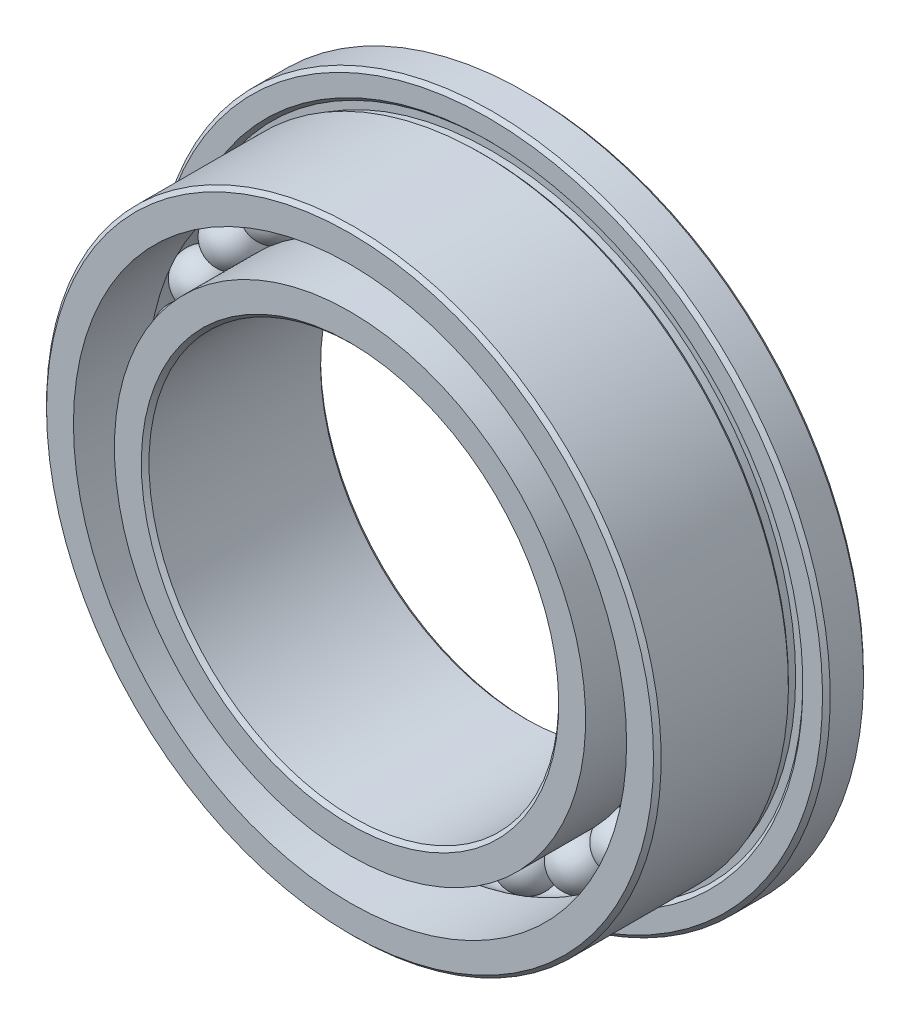
ISO-10303-21;
HEADER;
FILE_DESCRIPTION(('STEP AP214'),'2;1');
FILE_NAME('part.step','',(''),(''),'','','');
FILE_SCHEMA(('AUTOMOTIVE_DESIGN { 1 0 10303 214 1 1 1 1 }'));
ENDSEC;
DATA;
#1=APPLICATION_CONTEXT('core data for automotive mechanical design processes');
#2=APPLICATION_PROTOCOL_DEFINITION('international standard','automotive_design',2000,#1);
#3=PRODUCT_CONTEXT('',#1,'mechanical');
#4=PRODUCT('Part','Part','',(#3));
#5=PRODUCT_RELATED_PRODUCT_CATEGORY('part','',(#4));
#6=PRODUCT_DEFINITION_FORMATION('','',#4);
#7=PRODUCT_DEFINITION_CONTEXT('part definition',#1,'design');
#8=PRODUCT_DEFINITION('design','',#6,#7);
#9=PRODUCT_DEFINITION_SHAPE('','',#8);
#10=(LENGTH_UNIT() NAMED_UNIT(*) SI_UNIT(.MILLI.,.METRE.));
#11=(NAMED_UNIT(*) PLANE_ANGLE_UNIT() SI_UNIT($,.RADIAN.));
#12=(NAMED_UNIT(*) SI_UNIT($,.STERADIAN.) SOLID_ANGLE_UNIT());
#13=UNCERTAINTY_MEASURE_WITH_UNIT(LENGTH_MEASURE(1.E-05),#10,'distance_accuracy_value','');
#14=(GEOMETRIC_REPRESENTATION_CONTEXT(3) GLOBAL_UNCERTAINTY_ASSIGNED_CONTEXT((#13)) GLOBAL_UNIT_ASSIGNED_CONTEXT((#10,
#11,#12)) REPRESENTATION_CONTEXT('',''));
#15=CARTESIAN_POINT('',(0.,0.,0.));
#16=DIRECTION('',(0.,0.,1.));
#17=DIRECTION('',(1.,0.,0.));
#18=AXIS2_PLACEMENT_3D('',#15,#16,#17);
#19=CARTESIAN_POINT('',(-1.15307935371213,4.86522435289914,0.));
#20=DIRECTION('',(-0.230615870742427,0.973044870579827,0.));
#21=DIRECTION('',(0.973044870579827,0.230615870742427,0.));
#22=AXIS2_PLACEMENT_3D('',#19,#20,#21);
#23=SPHERICAL_SURFACE('',#22,0.5);
#24=CARTESIAN_POINT('',(-1.26838728908335,5.35174678818905,0.));
#25=VERTEX_POINT('',#24);
#26=VERTEX_LOOP('',#25);
#27=FACE_BOUND('',#26,.T.);
#28=ADVANCED_FACE('F47',(#27),#23,.T.);
#29=CLOSED_SHELL('',(#28));
#30=MANIFOLD_SOLID_BREP('B2',#29);
#31=CARTESIAN_POINT('',(-2.24399590100225,4.46816320161709,0.));
#32=DIRECTION('',(-0.448799180200451,0.893632640323418,0.));
#33=DIRECTION('',(0.893632640323418,0.448799180200451,0.));
#34=AXIS2_PLACEMENT_3D('',#31,#32,#33);
#35=SPHERICAL_SURFACE('',#34,0.5);
#36=CARTESIAN_POINT('',(-2.46839549110248,4.9149795217788,0.));
#37=VERTEX_POINT('',#36);
#38=VERTEX_LOOP('',#37);
#39=FACE_BOUND('',#38,.T.);
#40=ADVANCED_FACE('F69',(#39),#35,.T.);
#41=CLOSED_SHELL('',(#40));
#42=MANIFOLD_SOLID_BREP('B7',#41);
#43=CARTESIAN_POINT('',(-3.21393804843265,3.83022221559493,0.));
#44=DIRECTION('',(-0.642787609686529,0.766044443118986,0.));
#45=DIRECTION('',(0.766044443118986,0.642787609686529,0.));
#46=AXIS2_PLACEMENT_3D('',#43,#44,#45);
#47=SPHERICAL_SURFACE('',#46,0.5);
#48=CARTESIAN_POINT('',(-3.53533185327591,4.21324443715443,0.));
#49=VERTEX_POINT('',#48);
#50=VERTEX_LOOP('',#49);
#51=FACE_BOUND('',#50,.T.);
#52=ADVANCED_FACE('F88',(#51),#47,.T.);
#53=CLOSED_SHELL('',(#52));
#54=MANIFOLD_SOLID_BREP('B43',#53);
#55=CARTESIAN_POINT('',(-4.01061596377518,2.98579295851398,0.));
#56=DIRECTION('',(-0.802123192755037,0.597158591702796,0.));
#57=DIRECTION('',(0.597158591702796,0.802123192755037,0.));
#58=AXIS2_PLACEMENT_3D('',#55,#56,#57);
#59=SPHERICAL_SURFACE('',#58,0.5);
#60=CARTESIAN_POINT('',(-4.4116775601527,3.28437225436538,0.));
#61=VERTEX_POINT('',#60);
#62=VERTEX_LOOP('',#61);
#63=FACE_BOUND('',#62,.T.);
#64=ADVANCED_FACE('F107',(#63),#59,.T.);
#65=CLOSED_SHELL('',(#64));
#66=MANIFOLD_SOLID_BREP('B65',#65);
#67=CARTESIAN_POINT('',(-4.59108053440135,1.98039883019584,0.));
#68=DIRECTION('',(-0.91821610688027,0.396079766039167,0.));
#69=DIRECTION('',(0.396079766039167,0.91821610688027,0.));
#70=AXIS2_PLACEMENT_3D('',#67,#68,#69);
#71=SPHERICAL_SURFACE('',#70,0.5);
#72=CARTESIAN_POINT('',(-5.05018858784148,2.17843871321542,0.));
#73=VERTEX_POINT('',#72);
#74=VERTEX_LOOP('',#73);
#75=FACE_BOUND('',#74,.T.);
#76=ADVANCED_FACE('F126',(#75),#71,.T.);
#77=CLOSED_SHELL('',(#76));
#78=MANIFOLD_SOLID_BREP('B84',#77);
#79=CARTESIAN_POINT('',(-4.92403876506103,0.868240888334707,0.));
#80=DIRECTION('',(-0.984807753012206,0.173648177666941,0.));
#81=DIRECTION('',(0.173648177666941,0.984807753012206,0.));
#82=AXIS2_PLACEMENT_3D('',#79,#80,#81);
#83=SPHERICAL_SURFACE('',#82,0.5);
#84=CARTESIAN_POINT('',(-5.41644264156713,0.955064977168177,0.));
#85=VERTEX_POINT('',#84);
#86=VERTEX_LOOP('',#85);
#87=FACE_BOUND('',#86,.T.);
#88=ADVANCED_FACE('F145',(#87),#83,.T.);
#89=CLOSED_SHELL('',(#88));
#90=MANIFOLD_SOLID_BREP('B103',#89);
#91=CARTESIAN_POINT('',(-4.99154079135634,-0.290724144552328,0.));
#92=DIRECTION('',(-0.998308158271269,-0.0581448289104657,0.));
#93=DIRECTION('',(-0.0581448289104657,0.998308158271269,0.));
#94=AXIS2_PLACEMENT_3D('',#91,#92,#93);
#95=SPHERICAL_SURFACE('',#94,0.5);
#96=CARTESIAN_POINT('',(-5.49069487049198,-0.319796559007561,0.));
#97=VERTEX_POINT('',#96);
#98=VERTEX_LOOP('',#97);
#99=FACE_BOUND('',#98,.T.);
#100=ADVANCED_FACE('F164',(#99),#95,.T.);
#101=CLOSED_SHELL('',(#100));
#102=MANIFOLD_SOLID_BREP('B122',#101);
#103=CARTESIAN_POINT('',(-4.78994756157746,-1.4340161635554,0.));
#104=DIRECTION('',(-0.957989512315492,-0.286803232711081,0.));
#105=DIRECTION('',(-0.286803232711081,0.957989512315492,0.));
#106=AXIS2_PLACEMENT_3D('',#103,#104,#105);
#107=SPHERICAL_SURFACE('',#106,0.5);
#108=CARTESIAN_POINT('',(-5.26894231773521,-1.57741777991094,0.));
#109=VERTEX_POINT('',#108);
#110=VERTEX_LOOP('',#109);
#111=FACE_BOUND('',#110,.T.);
#112=ADVANCED_FACE('F183',(#111),#107,.T.);
#113=CLOSED_SHELL('',(#112));
#114=MANIFOLD_SOLID_BREP('B141',#113);
#115=CARTESIAN_POINT('',(-4.33012701892222,-2.49999999999996,0.));
#116=DIRECTION('',(-0.866025403784443,-0.499999999999992,0.));
#117=DIRECTION('',(-0.499999999999992,0.866025403784443,0.));
#118=AXIS2_PLACEMENT_3D('',#115,#116,#117);
#119=SPHERICAL_SURFACE('',#118,0.5);
#120=CARTESIAN_POINT('',(-4.76313972081444,-2.74999999999996,0.));
#121=VERTEX_POINT('',#120);
#122=VERTEX_LOOP('',#121);
#123=FACE_BOUND('',#122,.T.);
#124=ADVANCED_FACE('F202',(#123),#119,.T.);
#125=CLOSED_SHELL('',(#124));
#126=MANIFOLD_SOLID_BREP('B160',#125);
#127=CARTESIAN_POINT('',(-3.63686820786527,-3.43120818934364,0.));
#128=DIRECTION('',(-0.727373641573055,-0.686241637868727,0.));
#129=DIRECTION('',(-0.686241637868727,0.727373641573055,0.));
#130=AXIS2_PLACEMENT_3D('',#127,#128,#129);
#131=SPHERICAL_SURFACE('',#130,0.5);
#132=CARTESIAN_POINT('',(-4.0005550286518,-3.774329008278,0.));
#133=VERTEX_POINT('',#132);
#134=VERTEX_LOOP('',#133);
#135=FACE_BOUND('',#134,.T.);
#136=ADVANCED_FACE('F221',(#135),#131,.T.);
#137=CLOSED_SHELL('',(#136));
#138=MANIFOLD_SOLID_BREP('B179',#137);
#139=CARTESIAN_POINT('',(-2.74754489035407,-4.17743905706466,0.));
#140=DIRECTION('',(-0.549508978070813,-0.835487811412932,0.));
#141=DIRECTION('',(-0.835487811412932,0.549508978070813,0.));
#142=AXIS2_PLACEMENT_3D('',#139,#140,#141);
#143=SPHERICAL_SURFACE('',#142,0.5);
#144=CARTESIAN_POINT('',(-3.02229937938947,-4.59518296277112,0.));
#145=VERTEX_POINT('',#144);
#146=VERTEX_LOOP('',#145);
#147=FACE_BOUND('',#146,.T.);
#148=ADVANCED_FACE('F240',(#147),#143,.T.);
#149=CLOSED_SHELL('',(#148));
#150=MANIFOLD_SOLID_BREP('B198',#149);
#151=CARTESIAN_POINT('',(-1.71010071662838,-4.69846310392953,0.));
#152=DIRECTION('',(-0.342020143325676,-0.939692620785906,0.));
#153=DIRECTION('',(-0.939692620785906,0.342020143325676,0.));
#154=AXIS2_PLACEMENT_3D('',#151,#152,#153);
#155=SPHERICAL_SURFACE('',#154,0.5);
#156=CARTESIAN_POINT('',(-1.88111078829122,-5.16830941432248,0.));
#157=VERTEX_POINT('',#156);
#158=VERTEX_LOOP('',#157);
#159=FACE_BOUND('',#158,.T.);
#160=ADVANCED_FACE('F259',(#159),#155,.T.);
#161=CLOSED_SHELL('',(#160));
#162=MANIFOLD_SOLID_BREP('B217',#161);
#163=CARTESIAN_POINT('',(-0.580464570626188,-4.96619178870971,0.));
#164=DIRECTION('',(-0.116092914125238,-0.993238357741942,0.));
#165=DIRECTION('',(-0.993238357741942,0.116092914125238,0.));
#166=AXIS2_PLACEMENT_3D('',#163,#164,#165);
#167=SPHERICAL_SURFACE('',#166,0.5);
#168=CARTESIAN_POINT('',(-0.638511027688807,-5.46281096758068,0.));
#169=VERTEX_POINT('',#168);
#170=VERTEX_LOOP('',#169);
#171=FACE_BOUND('',#170,.T.);
#172=ADVANCED_FACE('F278',(#171),#167,.T.);
#173=CLOSED_SHELL('',(#172));
#174=MANIFOLD_SOLID_BREP('B236',#173);
#175=CARTESIAN_POINT('',(0.580464570626117,-4.96619178870972,0.));
#176=DIRECTION('',(0.116092914125223,-0.993238357741944,0.));
#177=DIRECTION('',(-0.993238357741944,-0.116092914125223,0.));
#178=AXIS2_PLACEMENT_3D('',#175,#176,#177);
#179=SPHERICAL_SURFACE('',#178,0.5);
#180=CARTESIAN_POINT('',(0.638511027688728,-5.46281096758069,0.));
#181=VERTEX_POINT('',#180);
#182=VERTEX_LOOP('',#181);
#183=FACE_BOUND('',#182,.T.);
#184=ADVANCED_FACE('F298',(#183),#179,.T.);
#185=CLOSED_SHELL('',(#184));
#186=MANIFOLD_SOLID_BREP('B255',#185);
#187=CARTESIAN_POINT('',(1.71010071662831,-4.69846310392955,0.));
#188=DIRECTION('',(0.342020143325663,-0.939692620785911,0.));
#189=DIRECTION('',(-0.939692620785911,-0.342020143325663,0.));
#190=AXIS2_PLACEMENT_3D('',#187,#188,#189);
#191=SPHERICAL_SURFACE('',#190,0.5);
#192=CARTESIAN_POINT('',(1.88111078829114,-5.16830941432251,0.));
#193=VERTEX_POINT('',#192);
#194=VERTEX_LOOP('',#193);
#195=FACE_BOUND('',#194,.T.);
#196=ADVANCED_FACE('F320',(#195),#191,.T.);
#197=CLOSED_SHELL('',(#196));
#198=MANIFOLD_SOLID_BREP('B274',#197);
#199=CARTESIAN_POINT('',(2.74754489035401,-4.1774390570647,0.));
#200=DIRECTION('',(0.549508978070801,-0.835487811412939,0.));
#201=DIRECTION('',(-0.835487811412939,-0.549508978070801,0.));
#202=AXIS2_PLACEMENT_3D('',#199,#200,#201);
#203=SPHERICAL_SURFACE('',#202,0.5);
#204=CARTESIAN_POINT('',(3.02229937938941,-4.59518296277117,0.));
#205=VERTEX_POINT('',#204);
#206=VERTEX_LOOP('',#205);
#207=FACE_BOUND('',#206,.T.);
#208=ADVANCED_FACE('F339',(#207),#203,.T.);
#209=CLOSED_SHELL('',(#208));
#210=MANIFOLD_SOLID_BREP('B294',#209);
#211=CARTESIAN_POINT('',(3.63686820786523,-3.43120818934369,0.));
#212=DIRECTION('',(0.727373641573045,-0.686241637868737,0.));
#213=DIRECTION('',(-0.686241637868737,-0.727373641573045,0.));
#214=AXIS2_PLACEMENT_3D('',#211,#212,#213);
#215=SPHERICAL_SURFACE('',#214,0.5);
#216=CARTESIAN_POINT('',(4.00055502865175,-3.77432900827805,0.));
#217=VERTEX_POINT('',#216);
#218=VERTEX_LOOP('',#217);
#219=FACE_BOUND('',#218,.T.);
#220=ADVANCED_FACE('F358',(#219),#215,.T.);
#221=CLOSED_SHELL('',(#220));
#222=MANIFOLD_SOLID_BREP('B316',#221);
#223=CARTESIAN_POINT('',(4.33012701892218,-2.50000000000002,0.));
#224=DIRECTION('',(0.866025403784436,-0.500000000000004,0.));
#225=DIRECTION('',(-0.500000000000004,-0.866025403784436,0.));
#226=AXIS2_PLACEMENT_3D('',#223,#224,#225);
#227=SPHERICAL_SURFACE('',#226,0.5);
#228=CARTESIAN_POINT('',(4.7631397208144,-2.75000000000002,0.));
#229=VERTEX_POINT('',#228);
#230=VERTEX_LOOP('',#229);
#231=FACE_BOUND('',#230,.T.);
#232=ADVANCED_FACE('F378',(#231),#227,.T.);
#233=CLOSED_SHELL('',(#232));
#234=MANIFOLD_SOLID_BREP('B335',#233);
#235=CARTESIAN_POINT('',(4.78994756157744,-1.43401616355547,0.));
#236=DIRECTION('',(0.957989512315488,-0.286803232711094,0.));
#237=DIRECTION('',(-0.286803232711094,-0.957989512315488,0.));
#238=AXIS2_PLACEMENT_3D('',#235,#236,#237);
#239=SPHERICAL_SURFACE('',#238,0.5);
#240=CARTESIAN_POINT('',(5.26894231773518,-1.57741777991102,0.));
#241=VERTEX_POINT('',#240);
#242=VERTEX_LOOP('',#241);
#243=FACE_BOUND('',#242,.T.);
#244=ADVANCED_FACE('F400',(#243),#239,.T.);
#245=CLOSED_SHELL('',(#244));
#246=MANIFOLD_SOLID_BREP('B354',#245);
#247=CARTESIAN_POINT('',(4.99154079135634,-0.290724144552398,0.));
#248=DIRECTION('',(0.998308158271268,-0.0581448289104795,0.));
#249=DIRECTION('',(-0.0581448289104795,-0.998308158271268,0.));
#250=AXIS2_PLACEMENT_3D('',#247,#248,#249);
#251=SPHERICAL_SURFACE('',#250,0.5);
#252=CARTESIAN_POINT('',(5.49069487049197,-0.319796559007637,0.));
#253=VERTEX_POINT('',#252);
#254=VERTEX_LOOP('',#253);
#255=FACE_BOUND('',#254,.T.);
#256=ADVANCED_FACE('F420',(#255),#251,.T.);
#257=CLOSED_SHELL('',(#256));
#258=MANIFOLD_SOLID_BREP('B374',#257);
#259=CARTESIAN_POINT('',(4.92403876506104,0.868240888334636,0.));
#260=DIRECTION('',(0.984807753012209,0.173648177666927,0.));
#261=DIRECTION('',(0.173648177666927,-0.984807753012209,0.));
#262=AXIS2_PLACEMENT_3D('',#259,#260,#261);
#263=SPHERICAL_SURFACE('',#262,0.5);
#264=CARTESIAN_POINT('',(5.41644264156715,0.955064977168099,0.));
#265=VERTEX_POINT('',#264);
#266=VERTEX_LOOP('',#265);
#267=FACE_BOUND('',#266,.T.);
#268=ADVANCED_FACE('F442',(#267),#263,.T.);
#269=CLOSED_SHELL('',(#268));
#270=MANIFOLD_SOLID_BREP('B396',#269);
#271=CARTESIAN_POINT('',(4.59108053440137,1.98039883019577,0.));
#272=DIRECTION('',(0.918216106880275,0.396079766039155,0.));
#273=DIRECTION('',(0.396079766039155,-0.918216106880275,0.));
#274=AXIS2_PLACEMENT_3D('',#271,#272,#273);
#275=SPHERICAL_SURFACE('',#274,0.5);
#276=CARTESIAN_POINT('',(5.05018858784151,2.17843871321535,0.));
#277=VERTEX_POINT('',#276);
#278=VERTEX_LOOP('',#277);
#279=FACE_BOUND('',#278,.T.);
#280=ADVANCED_FACE('F461',(#279),#275,.T.);
#281=CLOSED_SHELL('',(#280));
#282=MANIFOLD_SOLID_BREP('B416',#281);
#283=CARTESIAN_POINT('',(4.01061596377523,2.98579295851392,0.));
#284=DIRECTION('',(0.802123192755045,0.597158591702785,0.));
#285=DIRECTION('',(0.597158591702785,-0.802123192755045,0.));
#286=AXIS2_PLACEMENT_3D('',#283,#284,#285);
#287=SPHERICAL_SURFACE('',#286,0.5);
#288=CARTESIAN_POINT('',(4.41167756015275,3.28437225436531,0.));
#289=VERTEX_POINT('',#288);
#290=VERTEX_LOOP('',#289);
#291=FACE_BOUND('',#290,.T.);
#292=ADVANCED_FACE('F480',(#291),#287,.T.);
#293=CLOSED_SHELL('',(#292));
#294=MANIFOLD_SOLID_BREP('B438',#293);
#295=CARTESIAN_POINT('',(3.2139380484327,3.83022221559489,0.));
#296=DIRECTION('',(0.64278760968654,0.766044443118977,0.));
#297=DIRECTION('',(0.766044443118977,-0.64278760968654,0.));
#298=AXIS2_PLACEMENT_3D('',#295,#296,#297);
#299=SPHERICAL_SURFACE('',#298,0.5);
#300=CARTESIAN_POINT('',(3.53533185327597,4.21324443715437,0.));
#301=VERTEX_POINT('',#300);
#302=VERTEX_LOOP('',#301);
#303=FACE_BOUND('',#302,.T.);
#304=ADVANCED_FACE('F499',(#303),#299,.T.);
#305=CLOSED_SHELL('',(#304));
#306=MANIFOLD_SOLID_BREP('B457',#305);
#307=CARTESIAN_POINT('',(2.24399590100232,4.46816320161706,0.));
#308=DIRECTION('',(0.448799180200463,0.893632640323412,0.));
#309=DIRECTION('',(0.893632640323412,-0.448799180200463,0.));
#310=AXIS2_PLACEMENT_3D('',#307,#308,#309);
#311=SPHERICAL_SURFACE('',#310,0.5);
#312=CARTESIAN_POINT('',(2.46839549110255,4.91497952177876,0.));
#313=VERTEX_POINT('',#312);
#314=VERTEX_LOOP('',#313);
#315=FACE_BOUND('',#314,.T.);
#316=ADVANCED_FACE('F518',(#315),#311,.T.);
#317=CLOSED_SHELL('',(#316));
#318=MANIFOLD_SOLID_BREP('B476',#317);
#319=CARTESIAN_POINT('',(1.1530793537122,4.86522435289912,0.));
#320=DIRECTION('',(0.230615870742441,0.973044870579824,0.));
#321=DIRECTION('',(0.973044870579824,-0.230615870742441,0.));
#322=AXIS2_PLACEMENT_3D('',#319,#320,#321);
#323=SPHERICAL_SURFACE('',#322,0.5);
#324=CARTESIAN_POINT('',(1.26838728908342,5.35174678818903,0.));
#325=VERTEX_POINT('',#324);
#326=VERTEX_LOOP('',#325);
#327=FACE_BOUND('',#326,.T.);
#328=ADVANCED_FACE('F538',(#327),#323,.T.);
#329=CLOSED_SHELL('',(#328));
#330=MANIFOLD_SOLID_BREP('B495',#329);
#331=CARTESIAN_POINT('',(0.,5.,0.));
#332=DIRECTION('',(0.,1.,0.));
#333=DIRECTION('',(1.,0.,0.));
#334=AXIS2_PLACEMENT_3D('',#331,#332,#333);
#335=SPHERICAL_SURFACE('',#334,0.5);
#336=CARTESIAN_POINT('',(0.,5.5,0.));
#337=VERTEX_POINT('',#336);
#338=VERTEX_LOOP('',#337);
#339=FACE_BOUND('',#338,.T.);
#340=ADVANCED_FACE('F564',(#339),#335,.T.);
#341=CLOSED_SHELL('',(#340));
#342=MANIFOLD_SOLID_BREP('B514',#341);
#343=CARTESIAN_POINT('',(0.,0.,0.));
#344=DIRECTION('',(0.,0.,1.));
#345=DIRECTION('',(0.,-1.,0.));
#346=AXIS2_PLACEMENT_3D('',#343,#344,#345);
#347=CYLINDRICAL_SURFACE('',#346,4.6);
#348=CARTESIAN_POINT('',(0.,0.,-0.299999999999999));
#349=DIRECTION('',(0.,0.,1.));
#350=DIRECTION('',(0.,-1.,0.));
#351=AXIS2_PLACEMENT_3D('',#348,#349,#350);
#352=CIRCLE('',#351,4.6);
#353=CARTESIAN_POINT('',(0.,-4.6,-0.299999999999999));
#354=VERTEX_POINT('',#353);
#355=EDGE_CURVE('E612',#354,#354,#352,.T.);
#356=ORIENTED_EDGE('',*,*,#355,.F.);
#357=EDGE_LOOP('',(#356));
#358=FACE_BOUND('',#357,.T.);
#359=CARTESIAN_POINT('',(0.,0.,-1.75));
#360=DIRECTION('',(0.,0.,1.));
#361=DIRECTION('',(0.,-1.,0.));
#362=AXIS2_PLACEMENT_3D('',#359,#360,#361);
#363=CIRCLE('',#362,4.6);
#364=CARTESIAN_POINT('',(0.,-4.6,-1.75));
#365=VERTEX_POINT('',#364);
#366=EDGE_CURVE('E621',#365,#365,#363,.T.);
#367=ORIENTED_EDGE('',*,*,#366,.T.);
#368=EDGE_LOOP('',(#367));
#369=FACE_BOUND('',#368,.T.);
#370=ADVANCED_FACE('F592',(#358,#369),#347,.T.);
#371=CARTESIAN_POINT('',(0.,0.,0.));
#372=DIRECTION('',(0.,0.,1.));
#373=DIRECTION('',(0.,-1.,0.));
#374=AXIS2_PLACEMENT_3D('',#371,#372,#373);
#375=TOROIDAL_SURFACE('',#374,5.,0.5);
#376=CARTESIAN_POINT('',(0.,0.,0.3));
#377=DIRECTION('',(0.,0.,1.));
#378=DIRECTION('',(0.,-1.,0.));
#379=AXIS2_PLACEMENT_3D('',#376,#377,#378);
#380=CIRCLE('',#379,4.6);
#381=CARTESIAN_POINT('',(0.,-4.6,0.3));
#382=VERTEX_POINT('',#381);
#383=EDGE_CURVE('E615',#382,#382,#380,.T.);
#384=ORIENTED_EDGE('',*,*,#383,.F.);
#385=EDGE_LOOP('',(#384));
#386=FACE_BOUND('',#385,.T.);
#387=ORIENTED_EDGE('',*,*,#355,.T.);
#388=EDGE_LOOP('',(#387));
#389=FACE_BOUND('',#388,.T.);
#390=ADVANCED_FACE('F640',(#386,#389),#375,.F.);
#391=CARTESIAN_POINT('',(0.,0.,0.));
#392=DIRECTION('',(0.,0.,1.));
#393=DIRECTION('',(0.,-1.,0.));
#394=AXIS2_PLACEMENT_3D('',#391,#392,#393);
#395=CYLINDRICAL_SURFACE('',#394,4.6);
#396=CARTESIAN_POINT('',(0.,0.,1.75));
#397=DIRECTION('',(0.,0.,1.));
#398=DIRECTION('',(0.,-1.,0.));
#399=AXIS2_PLACEMENT_3D('',#396,#397,#398);
#400=CIRCLE('',#399,4.6);
#401=CARTESIAN_POINT('',(0.,-4.6,1.75));
#402=VERTEX_POINT('',#401);
#403=EDGE_CURVE('E618',#402,#402,#400,.T.);
#404=ORIENTED_EDGE('',*,*,#403,.F.);
#405=EDGE_LOOP('',(#404));
#406=FACE_BOUND('',#405,.T.);
#407=ORIENTED_EDGE('',*,*,#383,.T.);
#408=EDGE_LOOP('',(#407));
#409=FACE_BOUND('',#408,.T.);
#410=ADVANCED_FACE('F646',(#406,#409),#395,.T.);
#411=CARTESIAN_POINT('',(0.,4.,1.75));
#412=DIRECTION('',(0.,0.,-1.));
#413=DIRECTION('',(0.,1.,0.));
#414=AXIS2_PLACEMENT_3D('',#411,#412,#413);
#415=PLANE('',#414);
#416=CARTESIAN_POINT('',(0.,0.,1.75));
#417=DIRECTION('',(0.,0.,-1.));
#418=DIRECTION('',(0.,1.,0.));
#419=AXIS2_PLACEMENT_3D('',#416,#417,#418);
#420=CIRCLE('',#419,4.075);
#421=CARTESIAN_POINT('',(0.,4.075,1.75));
#422=VERTEX_POINT('',#421);
#423=EDGE_CURVE('E563',#422,#422,#420,.T.);
#424=ORIENTED_EDGE('',*,*,#423,.T.);
#425=EDGE_LOOP('',(#424));
#426=FACE_BOUND('',#425,.T.);
#427=ORIENTED_EDGE('',*,*,#403,.T.);
#428=EDGE_LOOP('',(#427));
#429=FACE_BOUND('',#428,.T.);
#430=ADVANCED_FACE('F637',(#426,#429),#415,.F.);
#431=CARTESIAN_POINT('',(0.,0.,0.));
#432=DIRECTION('',(0.,0.,1.));
#433=DIRECTION('',(0.,-1.,0.));
#434=AXIS2_PLACEMENT_3D('',#431,#432,#433);
#435=CYLINDRICAL_SURFACE('',#434,4.);
#436=CARTESIAN_POINT('',(0.,0.,-1.675));
#437=DIRECTION('',(0.,0.,1.));
#438=DIRECTION('',(0.,-1.,0.));
#439=AXIS2_PLACEMENT_3D('',#436,#437,#438);
#440=CIRCLE('',#439,4.);
#441=CARTESIAN_POINT('',(0.,-4.,-1.675));
#442=VERTEX_POINT('',#441);
#443=EDGE_CURVE('E599',#442,#442,#440,.F.);
#444=ORIENTED_EDGE('',*,*,#443,.T.);
#445=EDGE_LOOP('',(#444));
#446=FACE_BOUND('',#445,.T.);
#447=CARTESIAN_POINT('',(0.,0.,1.675));
#448=DIRECTION('',(0.,0.,-1.));
#449=DIRECTION('',(0.,1.,0.));
#450=AXIS2_PLACEMENT_3D('',#447,#448,#449);
#451=CIRCLE('',#450,4.);
#452=CARTESIAN_POINT('',(0.,4.,1.675));
#453=VERTEX_POINT('',#452);
#454=EDGE_CURVE('E603',#453,#453,#451,.F.);
#455=ORIENTED_EDGE('',*,*,#454,.T.);
#456=EDGE_LOOP('',(#455));
#457=FACE_BOUND('',#456,.T.);
#458=ADVANCED_FACE('F629',(#446,#457),#435,.F.);
#459=CARTESIAN_POINT('',(0.,4.6,-1.75));
#460=DIRECTION('',(0.,0.,1.));
#461=DIRECTION('',(0.,-1.,0.));
#462=AXIS2_PLACEMENT_3D('',#459,#460,#461);
#463=PLANE('',#462);
#464=CARTESIAN_POINT('',(0.,0.,-1.75));
#465=DIRECTION('',(0.,0.,1.));
#466=DIRECTION('',(0.,-1.,0.));
#467=AXIS2_PLACEMENT_3D('',#464,#465,#466);
#468=CIRCLE('',#467,4.075);
#469=CARTESIAN_POINT('',(0.,-4.075,-1.75));
#470=VERTEX_POINT('',#469);
#471=EDGE_CURVE('E607',#470,#470,#468,.T.);
#472=ORIENTED_EDGE('',*,*,#471,.T.);
#473=EDGE_LOOP('',(#472));
#474=FACE_BOUND('',#473,.T.);
#475=ORIENTED_EDGE('',*,*,#366,.F.);
#476=EDGE_LOOP('',(#475));
#477=FACE_BOUND('',#476,.T.);
#478=ADVANCED_FACE('F626',(#474,#477),#463,.F.);
#479=CARTESIAN_POINT('',(0.,0.,-1.75));
#480=DIRECTION('',(0.,0.,-1.));
#481=DIRECTION('',(0.,1.,0.));
#482=AXIS2_PLACEMENT_3D('',#479,#480,#481);
#483=CONICAL_SURFACE('',#482,4.075,0.785398163397451);
#484=ORIENTED_EDGE('',*,*,#443,.F.);
#485=EDGE_LOOP('',(#484));
#486=FACE_BOUND('',#485,.T.);
#487=ORIENTED_EDGE('',*,*,#471,.F.);
#488=EDGE_LOOP('',(#487));
#489=FACE_BOUND('',#488,.T.);
#490=ADVANCED_FACE('F628',(#486,#489),#483,.F.);
#491=CARTESIAN_POINT('',(0.,0.,1.675));
#492=DIRECTION('',(0.,0.,1.));
#493=DIRECTION('',(0.,-1.,0.));
#494=AXIS2_PLACEMENT_3D('',#491,#492,#493);
#495=CONICAL_SURFACE('',#494,4.,0.785398163397451);
#496=ORIENTED_EDGE('',*,*,#423,.F.);
#497=EDGE_LOOP('',(#496));
#498=FACE_BOUND('',#497,.T.);
#499=ORIENTED_EDGE('',*,*,#454,.F.);
#500=EDGE_LOOP('',(#499));
#501=FACE_BOUND('',#500,.T.);
#502=ADVANCED_FACE('F594',(#498,#501),#495,.F.);
#503=CLOSED_SHELL('',(#370,#390,#410,#430,#458,#478,#490,#502));
#504=MANIFOLD_SOLID_BREP('B534',#503);
#505=CARTESIAN_POINT('',(0.,5.4,-1.75));
#506=DIRECTION('',(0.,0.,1.));
#507=DIRECTION('',(0.,-1.,0.));
#508=AXIS2_PLACEMENT_3D('',#505,#506,#507);
#509=PLANE('',#508);
#510=CARTESIAN_POINT('',(0.,0.,-1.75));
#511=DIRECTION('',(0.,0.,1.));
#512=DIRECTION('',(0.,-1.,0.));
#513=AXIS2_PLACEMENT_3D('',#510,#511,#512);
#514=CIRCLE('',#513,6.525);
#515=CARTESIAN_POINT('',(0.,-6.525,-1.75));
#516=VERTEX_POINT('',#515);
#517=EDGE_CURVE('E735',#516,#516,#514,.F.);
#518=ORIENTED_EDGE('',*,*,#517,.T.);
#519=EDGE_LOOP('',(#518));
#520=FACE_BOUND('',#519,.T.);
#521=CARTESIAN_POINT('',(0.,0.,-1.75));
#522=DIRECTION('',(0.,0.,1.));
#523=DIRECTION('',(0.,-1.,0.));
#524=AXIS2_PLACEMENT_3D('',#521,#522,#523);
#525=CIRCLE('',#524,5.4);
#526=CARTESIAN_POINT('',(0.,-5.4,-1.75));
#527=VERTEX_POINT('',#526);
#528=EDGE_CURVE('E746',#527,#527,#525,.T.);
#529=ORIENTED_EDGE('',*,*,#528,.T.);
#530=EDGE_LOOP('',(#529));
#531=FACE_BOUND('',#530,.T.);
#532=ADVANCED_FACE('F720',(#520,#531),#509,.F.);
#533=CARTESIAN_POINT('',(0.,0.,0.));
#534=DIRECTION('',(0.,0.,1.));
#535=DIRECTION('',(0.,-1.,0.));
#536=AXIS2_PLACEMENT_3D('',#533,#534,#535);
#537=CYLINDRICAL_SURFACE('',#536,5.4);
#538=ORIENTED_EDGE('',*,*,#528,.F.);
#539=EDGE_LOOP('',(#538));
#540=FACE_BOUND('',#539,.T.);
#541=CARTESIAN_POINT('',(0.,0.,-0.299999999999999));
#542=DIRECTION('',(0.,0.,1.));
#543=DIRECTION('',(0.,-1.,0.));
#544=AXIS2_PLACEMENT_3D('',#541,#542,#543);
#545=CIRCLE('',#544,5.4);
#546=CARTESIAN_POINT('',(0.,-5.4,-0.299999999999999));
#547=VERTEX_POINT('',#546);
#548=EDGE_CURVE('E749',#547,#547,#545,.T.);
#549=ORIENTED_EDGE('',*,*,#548,.T.);
#550=EDGE_LOOP('',(#549));
#551=FACE_BOUND('',#550,.T.);
#552=ADVANCED_FACE('F792',(#540,#551),#537,.F.);
#553=CARTESIAN_POINT('',(0.,0.,0.));
#554=DIRECTION('',(0.,0.,1.));
#555=DIRECTION('',(0.,-1.,0.));
#556=AXIS2_PLACEMENT_3D('',#553,#554,#555);
#557=TOROIDAL_SURFACE('',#556,5.,0.5);
#558=ORIENTED_EDGE('',*,*,#548,.F.);
#559=EDGE_LOOP('',(#558));
#560=FACE_BOUND('',#559,.T.);
#561=CARTESIAN_POINT('',(0.,0.,0.3));
#562=DIRECTION('',(0.,0.,1.));
#563=DIRECTION('',(0.,-1.,0.));
#564=AXIS2_PLACEMENT_3D('',#561,#562,#563);
#565=CIRCLE('',#564,5.4);
#566=CARTESIAN_POINT('',(0.,-5.4,0.3));
#567=VERTEX_POINT('',#566);
#568=EDGE_CURVE('E752',#567,#567,#565,.T.);
#569=ORIENTED_EDGE('',*,*,#568,.T.);
#570=EDGE_LOOP('',(#569));
#571=FACE_BOUND('',#570,.T.);
#572=ADVANCED_FACE('F798',(#560,#571),#557,.F.);
#573=CARTESIAN_POINT('',(0.,0.,0.));
#574=DIRECTION('',(0.,0.,1.));
#575=DIRECTION('',(0.,-1.,0.));
#576=AXIS2_PLACEMENT_3D('',#573,#574,#575);
#577=CYLINDRICAL_SURFACE('',#576,5.4);
#578=ORIENTED_EDGE('',*,*,#568,.F.);
#579=EDGE_LOOP('',(#578));
#580=FACE_BOUND('',#579,.T.);
#581=CARTESIAN_POINT('',(0.,0.,1.75));
#582=DIRECTION('',(0.,0.,1.));
#583=DIRECTION('',(0.,-1.,0.));
#584=AXIS2_PLACEMENT_3D('',#581,#582,#583);
#585=CIRCLE('',#584,5.4);
#586=CARTESIAN_POINT('',(0.,-5.4,1.75));
#587=VERTEX_POINT('',#586);
#588=EDGE_CURVE('E755',#587,#587,#585,.T.);
#589=ORIENTED_EDGE('',*,*,#588,.T.);
#590=EDGE_LOOP('',(#589));
#591=FACE_BOUND('',#590,.T.);
#592=ADVANCED_FACE('F862',(#580,#591),#577,.F.);
#593=CARTESIAN_POINT('',(0.,6.,1.75));
#594=DIRECTION('',(0.,0.,-1.));
#595=DIRECTION('',(0.,1.,0.));
#596=AXIS2_PLACEMENT_3D('',#593,#594,#595);
#597=PLANE('',#596);
#598=CARTESIAN_POINT('',(0.,0.,1.75));
#599=DIRECTION('',(0.,0.,-1.));
#600=DIRECTION('',(0.,1.,0.));
#601=AXIS2_PLACEMENT_3D('',#598,#599,#600);
#602=CIRCLE('',#601,5.925);
#603=CARTESIAN_POINT('',(0.,5.925,1.75));
#604=VERTEX_POINT('',#603);
#605=EDGE_CURVE('E727',#604,#604,#602,.F.);
#606=ORIENTED_EDGE('',*,*,#605,.T.);
#607=EDGE_LOOP('',(#606));
#608=FACE_BOUND('',#607,.T.);
#609=ORIENTED_EDGE('',*,*,#588,.F.);
#610=EDGE_LOOP('',(#609));
#611=FACE_BOUND('',#610,.T.);
#612=ADVANCED_FACE('F852',(#608,#611),#597,.F.);
#613=CARTESIAN_POINT('',(0.,0.,0.));
#614=DIRECTION('',(0.,0.,1.));
#615=DIRECTION('',(0.,-1.,0.));
#616=AXIS2_PLACEMENT_3D('',#613,#614,#615);
#617=CYLINDRICAL_SURFACE('',#616,6.);
#618=CARTESIAN_POINT('',(0.,0.,1.675));
#619=DIRECTION('',(0.,0.,-1.));
#620=DIRECTION('',(0.,1.,0.));
#621=AXIS2_PLACEMENT_3D('',#618,#619,#620);
#622=CIRCLE('',#621,6.);
#623=CARTESIAN_POINT('',(0.,6.,1.675));
#624=VERTEX_POINT('',#623);
#625=EDGE_CURVE('E591',#624,#624,#622,.T.);
#626=ORIENTED_EDGE('',*,*,#625,.T.);
#627=EDGE_LOOP('',(#626));
#628=FACE_BOUND('',#627,.T.);
#629=CARTESIAN_POINT('',(0.,0.,-0.808578643762693));
#630=DIRECTION('',(0.,0.,1.));
#631=DIRECTION('',(0.,-1.,0.));
#632=AXIS2_PLACEMENT_3D('',#629,#630,#631);
#633=CIRCLE('',#632,6.);
#634=CARTESIAN_POINT('',(0.,-6.,-0.808578643762693));
#635=VERTEX_POINT('',#634);
#636=EDGE_CURVE('E758',#635,#635,#633,.T.);
#637=ORIENTED_EDGE('',*,*,#636,.T.);
#638=EDGE_LOOP('',(#637));
#639=FACE_BOUND('',#638,.T.);
#640=ADVANCED_FACE('F846',(#628,#639),#617,.T.);
#641=CARTESIAN_POINT('',(0.,0.,-0.879289321881347));
#642=DIRECTION('',(0.,0.,1.));
#643=DIRECTION('',(0.,-1.,0.));
#644=AXIS2_PLACEMENT_3D('',#641,#642,#643);
#645=CONICAL_SURFACE('',#644,5.92928932188135,0.785398163397451);
#646=ORIENTED_EDGE('',*,*,#636,.F.);
#647=EDGE_LOOP('',(#646));
#648=FACE_BOUND('',#647,.T.);
#649=CARTESIAN_POINT('',(0.,0.,-0.879289321881347));
#650=DIRECTION('',(0.,0.,1.));
#651=DIRECTION('',(0.,-1.,0.));
#652=AXIS2_PLACEMENT_3D('',#649,#650,#651);
#653=CIRCLE('',#652,5.92928932188135);
#654=CARTESIAN_POINT('',(0.,-5.92928932188135,-0.879289321881347));
#655=VERTEX_POINT('',#654);
#656=EDGE_CURVE('E761',#655,#655,#653,.T.);
#657=ORIENTED_EDGE('',*,*,#656,.T.);
#658=EDGE_LOOP('',(#657));
#659=FACE_BOUND('',#658,.T.);
#660=ADVANCED_FACE('F851',(#648,#659),#645,.T.);
#661=CARTESIAN_POINT('',(0.,0.,0.));
#662=DIRECTION('',(0.,0.,1.));
#663=DIRECTION('',(0.,-1.,0.));
#664=AXIS2_PLACEMENT_3D('',#661,#662,#663);
#665=CYLINDRICAL_SURFACE('',#664,5.92928932188135);
#666=ORIENTED_EDGE('',*,*,#656,.F.);
#667=EDGE_LOOP('',(#666));
#668=FACE_BOUND('',#667,.T.);
#669=CARTESIAN_POINT('',(0.,0.,-1.02071067811866));
#670=DIRECTION('',(0.,0.,1.));
#671=DIRECTION('',(0.,-1.,0.));
#672=AXIS2_PLACEMENT_3D('',#669,#670,#671);
#673=CIRCLE('',#672,5.92928932188135);
#674=CARTESIAN_POINT('',(0.,-5.92928932188135,-1.02071067811866));
#675=VERTEX_POINT('',#674);
#676=EDGE_CURVE('E764',#675,#675,#673,.T.);
#677=ORIENTED_EDGE('',*,*,#676,.T.);
#678=EDGE_LOOP('',(#677));
#679=FACE_BOUND('',#678,.T.);
#680=ADVANCED_FACE('F884',(#668,#679),#665,.T.);
#681=CARTESIAN_POINT('',(0.,6.07071067811865,-1.02071067811866));
#682=DIRECTION('',(0.,0.,-1.));
#683=DIRECTION('',(0.,1.,0.));
#684=AXIS2_PLACEMENT_3D('',#681,#682,#683);
#685=PLANE('',#684);
#686=ORIENTED_EDGE('',*,*,#676,.F.);
#687=EDGE_LOOP('',(#686));
#688=FACE_BOUND('',#687,.T.);
#689=CARTESIAN_POINT('',(0.,0.,-1.02071067811866));
#690=DIRECTION('',(0.,0.,1.));
#691=DIRECTION('',(0.,-1.,0.));
#692=AXIS2_PLACEMENT_3D('',#689,#690,#691);
#693=CIRCLE('',#692,6.07071067811865);
#694=CARTESIAN_POINT('',(0.,-6.07071067811865,-1.02071067811866));
#695=VERTEX_POINT('',#694);
#696=EDGE_CURVE('E767',#695,#695,#693,.T.);
#697=ORIENTED_EDGE('',*,*,#696,.T.);
#698=EDGE_LOOP('',(#697));
#699=FACE_BOUND('',#698,.T.);
#700=ADVANCED_FACE('F788',(#688,#699),#685,.F.);
#701=CARTESIAN_POINT('',(0.,0.,-0.950000000000001));
#702=DIRECTION('',(0.,0.,1.));
#703=DIRECTION('',(0.,-1.,0.));
#704=AXIS2_PLACEMENT_3D('',#701,#702,#703);
#705=CONICAL_SURFACE('',#704,6.14142135623731,0.785398163397451);
#706=ORIENTED_EDGE('',*,*,#696,.F.);
#707=EDGE_LOOP('',(#706));
#708=FACE_BOUND('',#707,.T.);
#709=CARTESIAN_POINT('',(0.,0.,-0.950000000000001));
#710=DIRECTION('',(0.,0.,1.));
#711=DIRECTION('',(0.,-1.,0.));
#712=AXIS2_PLACEMENT_3D('',#709,#710,#711);
#713=CIRCLE('',#712,6.14142135623731);
#714=CARTESIAN_POINT('',(0.,-6.14142135623731,-0.950000000000001));
#715=VERTEX_POINT('',#714);
#716=EDGE_CURVE('E770',#715,#715,#713,.T.);
#717=ORIENTED_EDGE('',*,*,#716,.T.);
#718=EDGE_LOOP('',(#717));
#719=FACE_BOUND('',#718,.T.);
#720=ADVANCED_FACE('F774',(#708,#719),#705,.F.);
#721=CARTESIAN_POINT('',(0.,6.6,-0.950000000000001));
#722=DIRECTION('',(0.,0.,-1.));
#723=DIRECTION('',(0.,1.,0.));
#724=AXIS2_PLACEMENT_3D('',#721,#722,#723);
#725=PLANE('',#724);
#726=CARTESIAN_POINT('',(0.,0.,-0.950000000000001));
#727=DIRECTION('',(0.,0.,-1.));
#728=DIRECTION('',(0.,1.,0.));
#729=AXIS2_PLACEMENT_3D('',#726,#727,#728);
#730=CIRCLE('',#729,6.525);
#731=CARTESIAN_POINT('',(0.,6.525,-0.950000000000001));
#732=VERTEX_POINT('',#731);
#733=EDGE_CURVE('E731',#732,#732,#730,.F.);
#734=ORIENTED_EDGE('',*,*,#733,.T.);
#735=EDGE_LOOP('',(#734));
#736=FACE_BOUND('',#735,.T.);
#737=ORIENTED_EDGE('',*,*,#716,.F.);
#738=EDGE_LOOP('',(#737));
#739=FACE_BOUND('',#738,.T.);
#740=ADVANCED_FACE('F776',(#736,#739),#725,.F.);
#741=CARTESIAN_POINT('',(0.,0.,0.));
#742=DIRECTION('',(0.,0.,1.));
#743=DIRECTION('',(0.,-1.,0.));
#744=AXIS2_PLACEMENT_3D('',#741,#742,#743);
#745=CYLINDRICAL_SURFACE('',#744,6.6);
#746=CARTESIAN_POINT('',(0.,0.,-1.675));
#747=DIRECTION('',(0.,0.,1.));
#748=DIRECTION('',(0.,-1.,0.));
#749=AXIS2_PLACEMENT_3D('',#746,#747,#748);
#750=CIRCLE('',#749,6.6);
#751=CARTESIAN_POINT('',(0.,-6.6,-1.675));
#752=VERTEX_POINT('',#751);
#753=EDGE_CURVE('E740',#752,#752,#750,.T.);
#754=ORIENTED_EDGE('',*,*,#753,.T.);
#755=EDGE_LOOP('',(#754));
#756=FACE_BOUND('',#755,.T.);
#757=CARTESIAN_POINT('',(0.,0.,-1.025));
#758=DIRECTION('',(0.,0.,-1.));
#759=DIRECTION('',(0.,1.,0.));
#760=AXIS2_PLACEMENT_3D('',#757,#758,#759);
#761=CIRCLE('',#760,6.6);
#762=CARTESIAN_POINT('',(0.,6.6,-1.025));
#763=VERTEX_POINT('',#762);
#764=EDGE_CURVE('E743',#763,#763,#761,.T.);
#765=ORIENTED_EDGE('',*,*,#764,.T.);
#766=EDGE_LOOP('',(#765));
#767=FACE_BOUND('',#766,.T.);
#768=ADVANCED_FACE('F778',(#756,#767),#745,.T.);
#769=CARTESIAN_POINT('',(0.,0.,-1.675));
#770=DIRECTION('',(0.,0.,1.));
#771=DIRECTION('',(0.,-1.,0.));
#772=AXIS2_PLACEMENT_3D('',#769,#770,#771);
#773=CONICAL_SURFACE('',#772,6.6,0.785398163397451);
#774=ORIENTED_EDGE('',*,*,#517,.F.);
#775=EDGE_LOOP('',(#774));
#776=FACE_BOUND('',#775,.T.);
#777=ORIENTED_EDGE('',*,*,#753,.F.);
#778=EDGE_LOOP('',(#777));
#779=FACE_BOUND('',#778,.T.);
#780=ADVANCED_FACE('F785',(#776,#779),#773,.T.);
#781=CARTESIAN_POINT('',(0.,0.,-0.950000000000001));
#782=DIRECTION('',(0.,0.,-1.));
#783=DIRECTION('',(0.,1.,0.));
#784=AXIS2_PLACEMENT_3D('',#781,#782,#783);
#785=CONICAL_SURFACE('',#784,6.525,0.78539816339745);
#786=ORIENTED_EDGE('',*,*,#764,.F.);
#787=EDGE_LOOP('',(#786));
#788=FACE_BOUND('',#787,.T.);
#789=ORIENTED_EDGE('',*,*,#733,.F.);
#790=EDGE_LOOP('',(#789));
#791=FACE_BOUND('',#790,.T.);
#792=ADVANCED_FACE('F805',(#788,#791),#785,.T.);
#793=CARTESIAN_POINT('',(0.,0.,1.75));
#794=DIRECTION('',(0.,0.,-1.));
#795=DIRECTION('',(0.,1.,0.));
#796=AXIS2_PLACEMENT_3D('',#793,#794,#795);
#797=CONICAL_SURFACE('',#796,5.925,0.785398163397451);
#798=ORIENTED_EDGE('',*,*,#625,.F.);
#799=EDGE_LOOP('',(#798));
#800=FACE_BOUND('',#799,.T.);
#801=ORIENTED_EDGE('',*,*,#605,.F.);
#802=EDGE_LOOP('',(#801));
#803=FACE_BOUND('',#802,.T.);
#804=ADVANCED_FACE('F722',(#800,#803),#797,.T.);
#805=CLOSED_SHELL('',(#532,#552,#572,#592,#612,#640,#660,#680,#700,#720,#740,#768,#780,#792,#804));
#806=MANIFOLD_SOLID_BREP('B558',#805);
#807=ADVANCED_BREP_SHAPE_REPRESENTATION('',(#18,#30,#42,#54,#66,#78,#90,#102,#114,#126,#138,
#150,#162,#174,#186,#198,#210,#222,#234,#246,#258,#270,#282,#294,#306,#318,#330,#342,#504,#806),#14);
#808=SHAPE_DEFINITION_REPRESENTATION(#9,#807);
ENDSEC;
END-ISO-10303-21;
